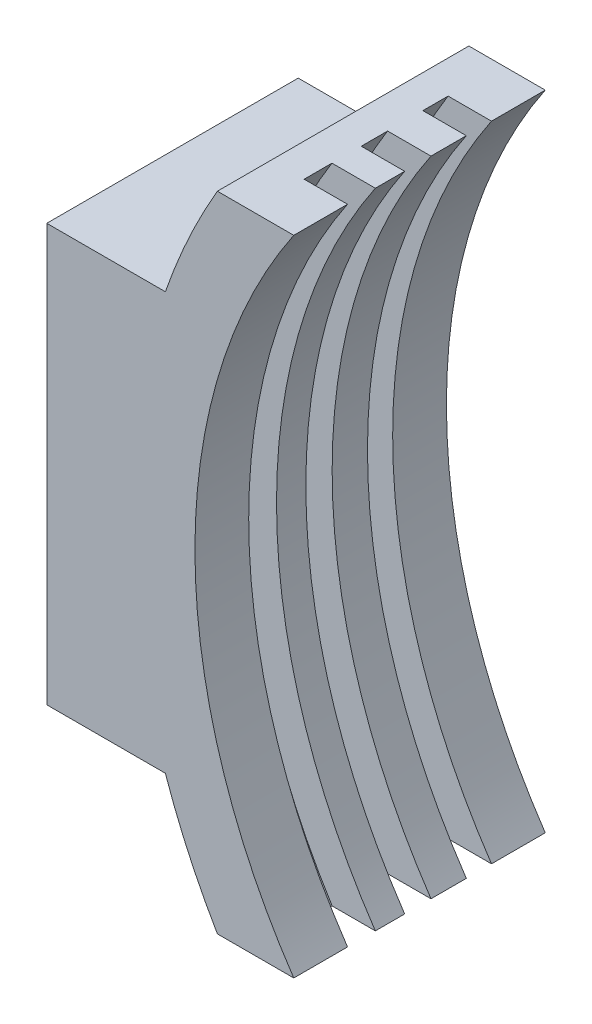
ISO-10303-21;
HEADER;
FILE_DESCRIPTION(('STEP AP214'),'2;1');
FILE_NAME('part.step','',(''),(''),'','','');
FILE_SCHEMA(('AUTOMOTIVE_DESIGN { 1 0 10303 214 1 1 1 1 }'));
ENDSEC;
DATA;
#1=APPLICATION_CONTEXT('core data for automotive mechanical design processes');
#2=APPLICATION_PROTOCOL_DEFINITION('international standard','automotive_design',2000,#1);
#3=PRODUCT_CONTEXT('',#1,'mechanical');
#4=PRODUCT('Part','Part','',(#3));
#5=PRODUCT_RELATED_PRODUCT_CATEGORY('part','',(#4));
#6=PRODUCT_DEFINITION_FORMATION('','',#4);
#7=PRODUCT_DEFINITION_CONTEXT('part definition',#1,'design');
#8=PRODUCT_DEFINITION('design','',#6,#7);
#9=PRODUCT_DEFINITION_SHAPE('','',#8);
#10=(LENGTH_UNIT() NAMED_UNIT(*) SI_UNIT(.MILLI.,.METRE.));
#11=(NAMED_UNIT(*) PLANE_ANGLE_UNIT() SI_UNIT($,.RADIAN.));
#12=(NAMED_UNIT(*) SI_UNIT($,.STERADIAN.) SOLID_ANGLE_UNIT());
#13=UNCERTAINTY_MEASURE_WITH_UNIT(LENGTH_MEASURE(1.E-05),#10,'distance_accuracy_value','');
#14=(GEOMETRIC_REPRESENTATION_CONTEXT(3) GLOBAL_UNCERTAINTY_ASSIGNED_CONTEXT((#13)) GLOBAL_UNIT_ASSIGNED_CONTEXT((#10,
#11,#12)) REPRESENTATION_CONTEXT('',''));
#15=CARTESIAN_POINT('',(0.,0.,0.));
#16=DIRECTION('',(0.,0.,1.));
#17=DIRECTION('',(1.,0.,0.));
#18=AXIS2_PLACEMENT_3D('',#15,#16,#17);
#19=CARTESIAN_POINT('',(2.33847709716404,-17.6822716441457,103.936667758293));
#20=DIRECTION('',(0.,1.,0.));
#21=DIRECTION('',(0.,0.,1.));
#22=AXIS2_PLACEMENT_3D('',#19,#20,#21);
#23=PLANE('',#22);
#24=CARTESIAN_POINT('',(2.59135219597086,-17.682271644147,136.685134373082));
#25=CARTESIAN_POINT('',(2.26631899742951,-17.6822716441462,136.685134373082));
#26=CARTESIAN_POINT('',(1.94128579888817,-17.6822716441459,136.685134373082));
#27=CARTESIAN_POINT('',(1.45373600107615,-17.6822716441457,136.685134373082));
#28=CARTESIAN_POINT('',(1.29121940180547,-17.6822716441457,136.685134373082));
#29=CARTESIAN_POINT('',(0.966186203263053,-17.6822716441458,136.685134373082));
#30=CARTESIAN_POINT('',(0.803669603991306,-17.6822716441459,136.685134373082));
#31=CARTESIAN_POINT('',(0.641153004719559,-17.682271644146,136.685134373082));
#32=B_SPLINE_CURVE_WITH_KNOTS('',3,(#24,#25,#26,#27,#28,#29,#30,#31),.UNSPECIFIED.,.F.,.F.,(4,2,
2,4),(0.,0.975099595624041,1.46264939343606,1.9501991912513),.UNSPECIFIED.);
#33=CARTESIAN_POINT('',(2.33847709716403,-17.6822716441457,136.685134373082));
#34=VERTEX_POINT('',#33);
#35=CARTESIAN_POINT('',(0.641153004722779,-17.6822716441512,136.685134373082));
#36=VERTEX_POINT('',#35);
#37=EDGE_CURVE('E184',#34,#36,#32,.T.);
#38=ORIENTED_EDGE('',*,*,#37,.T.);
#39=DIRECTION('',(1.17860060000748E-13,-1.20637906532752E-13,-1.));
#40=VECTOR('',#39,1.);
#41=CARTESIAN_POINT('',(0.641153004719128,-17.6822716441457,137.23155874318));
#42=LINE('',#41,#40);
#43=CARTESIAN_POINT('',(0.641153004718913,-17.6822716441458,137.777983113278));
#44=VERTEX_POINT('',#43);
#45=EDGE_CURVE('E183',#36,#44,#42,.F.);
#46=ORIENTED_EDGE('',*,*,#45,.T.);
#47=CARTESIAN_POINT('',(0.641153004722285,-17.6822716441485,137.777983113278));
#48=CARTESIAN_POINT('',(0.803669603992983,-17.6822716441469,137.777983113278));
#49=CARTESIAN_POINT('',(0.966186203263682,-17.6822716441461,137.777983113278));
#50=CARTESIAN_POINT('',(1.29121940180508,-17.6822716441454,137.777983113278));
#51=CARTESIAN_POINT('',(1.45373600107578,-17.6822716441455,137.777983113278));
#52=CARTESIAN_POINT('',(1.94128579888734,-17.6822716441462,137.777983113278));
#53=CARTESIAN_POINT('',(2.2663189974282,-17.6822716441471,137.777983113278));
#54=CARTESIAN_POINT('',(2.59135219596907,-17.6822716441459,137.777983113278));
#55=B_SPLINE_CURVE_WITH_KNOTS('',3,(#47,#48,#49,#50,#51,#52,#53,#54),.UNSPECIFIED.,.F.,.F.,(4,2,
2,4),(0.,0.487549797812095,0.97509959562419,1.95019919124678),.UNSPECIFIED.);
#56=CARTESIAN_POINT('',(2.33847709713561,-17.6822716441457,137.777983113278));
#57=VERTEX_POINT('',#56);
#58=EDGE_CURVE('E190',#44,#57,#55,.T.);
#59=ORIENTED_EDGE('',*,*,#58,.T.);
#60=DIRECTION('',(0.,0.,1.));
#61=VECTOR('',#60,1.);
#62=CARTESIAN_POINT('',(2.33847709716403,-17.6822716441457,103.936667758293));
#63=LINE('',#62,#61);
#64=CARTESIAN_POINT('',(2.33847709716403,-17.6822716441457,139.890052007236));
#65=VERTEX_POINT('',#64);
#66=EDGE_CURVE('E383',#57,#65,#63,.T.);
#67=ORIENTED_EDGE('',*,*,#66,.T.);
#68=DIRECTION('',(-1.,0.,0.));
#69=VECTOR('',#68,1.);
#70=CARTESIAN_POINT('',(2.33847709716404,-17.6822716441457,139.890052007236));
#71=LINE('',#70,#69);
#72=CARTESIAN_POINT('',(-0.662612790433288,-17.6822716441457,139.890052007236));
#73=VERTEX_POINT('',#72);
#74=EDGE_CURVE('E365',#65,#73,#71,.T.);
#75=ORIENTED_EDGE('',*,*,#74,.T.);
#76=DIRECTION('',(0.,0.,1.));
#77=VECTOR('',#76,1.);
#78=CARTESIAN_POINT('',(-0.662612790433288,-17.6822716441457,103.936667758293));
#79=LINE('',#78,#77);
#80=CARTESIAN_POINT('',(-0.662612790433288,-17.6822716441457,130.009975264211));
#81=VERTEX_POINT('',#80);
#82=EDGE_CURVE('E396',#81,#73,#79,.T.);
#83=ORIENTED_EDGE('',*,*,#82,.F.);
#84=DIRECTION('',(-1.,0.,0.));
#85=VECTOR('',#84,1.);
#86=CARTESIAN_POINT('',(2.33847709716404,-17.6822716441457,130.009975264211));
#87=LINE('',#86,#85);
#88=CARTESIAN_POINT('',(2.33847709716403,-17.6822716441457,130.009975264211));
#89=VERTEX_POINT('',#88);
#90=EDGE_CURVE('E393',#89,#81,#87,.T.);
#91=ORIENTED_EDGE('',*,*,#90,.F.);
#92=CARTESIAN_POINT('',(2.33847709716403,-17.6822716441457,132.121752471455));
#93=VERTEX_POINT('',#92);
#94=EDGE_CURVE('E375',#89,#93,#63,.T.);
#95=ORIENTED_EDGE('',*,*,#94,.T.);
#96=CARTESIAN_POINT('',(2.59132516654558,-17.682271644147,132.121752471455));
#97=CARTESIAN_POINT('',(2.26628647072023,-17.6822716441463,132.121752471455));
#98=CARTESIAN_POINT('',(1.94124777489487,-17.6822716441459,132.121752471454));
#99=CARTESIAN_POINT('',(1.45368973115684,-17.6822716441457,132.121752471453));
#100=CARTESIAN_POINT('',(1.29117038324416,-17.6822716441457,132.121752471453));
#101=CARTESIAN_POINT('',(0.966131687417705,-17.6822716441458,132.121752471452));
#102=CARTESIAN_POINT('',(0.803612339503932,-17.6822716441459,132.121752471452));
#103=CARTESIAN_POINT('',(0.641092991590159,-17.682271644146,132.121752471451));
#104=B_SPLINE_CURVE_WITH_KNOTS('',3,(#96,#97,#98,#99,#100,#101,#102,#103),.UNSPECIFIED.,.F.,.F.,
(4,2,2,4),(0.,0.975116087476069,1.4626741312141,1.95023217495542),.UNSPECIFIED.);
#105=CARTESIAN_POINT('',(0.641092991593444,-17.6822716441513,132.121752471451));
#106=VERTEX_POINT('',#105);
#107=EDGE_CURVE('E286',#93,#106,#104,.T.);
#108=ORIENTED_EDGE('',*,*,#107,.T.);
#109=DIRECTION('',(0.,0.,-1.));
#110=VECTOR('',#109,1.);
#111=CARTESIAN_POINT('',(0.641092991592245,-17.6822716441458,132.616488049784));
#112=LINE('',#111,#110);
#113=CARTESIAN_POINT('',(0.641092991593897,-17.6822716441448,133.111223628116));
#114=VERTEX_POINT('',#113);
#115=EDGE_CURVE('E303',#106,#114,#112,.F.);
#116=ORIENTED_EDGE('',*,*,#115,.T.);
#117=CARTESIAN_POINT('',(0.641092991597995,-17.6822716441485,133.111223628116));
#118=CARTESIAN_POINT('',(0.803612339510466,-17.6822716441469,133.111223628116));
#119=CARTESIAN_POINT('',(0.966131687422936,-17.6822716441461,133.111223628116));
#120=CARTESIAN_POINT('',(1.29117038324788,-17.6822716441454,133.111223628117));
#121=CARTESIAN_POINT('',(1.45368973116035,-17.6822716441455,133.111223628118));
#122=CARTESIAN_POINT('',(1.94124777489723,-17.6822716441462,133.111223628118));
#123=CARTESIAN_POINT('',(2.26628647072164,-17.6822716441472,133.111223628119));
#124=CARTESIAN_POINT('',(2.59132516654604,-17.6822716441459,133.111223628119));
#125=B_SPLINE_CURVE_WITH_KNOTS('',3,(#117,#118,#119,#120,#121,#122,#123,#124),.UNSPECIFIED.,.F.,
.F.,(4,2,2,4),(0.,0.487558043737411,0.975116087474822,1.95023217494805),.UNSPECIFIED.);
#126=CARTESIAN_POINT('',(2.33847709716403,-17.6822716441458,133.111223628119));
#127=VERTEX_POINT('',#126);
#128=EDGE_CURVE('E294',#114,#127,#125,.T.);
#129=ORIENTED_EDGE('',*,*,#128,.T.);
#130=CARTESIAN_POINT('',(2.33847709716403,-17.6822716441458,134.499436892681));
#131=VERTEX_POINT('',#130);
#132=EDGE_CURVE('E381',#127,#131,#63,.T.);
#133=ORIENTED_EDGE('',*,*,#132,.T.);
#134=CARTESIAN_POINT('',(2.59135034117733,-17.682271644147,134.499436892682));
#135=CARTESIAN_POINT('',(2.26631715955795,-17.6822716441462,134.499436892681));
#136=CARTESIAN_POINT('',(1.94128397793857,-17.6822716441459,134.49943689268));
#137=CARTESIAN_POINT('',(1.4537342055095,-17.6822716441457,134.499436892678));
#138=CARTESIAN_POINT('',(1.29121761469981,-17.6822716441457,134.499436892677));
#139=CARTESIAN_POINT('',(0.96618443307936,-17.6822716441458,134.499436892676));
#140=CARTESIAN_POINT('',(0.803667842268597,-17.6822716441459,134.499436892676));
#141=CARTESIAN_POINT('',(0.641151251457834,-17.682271644146,134.499436892675));
#142=B_SPLINE_CURVE_WITH_KNOTS('',3,(#134,#135,#136,#137,#138,#139,#140,#141),.UNSPECIFIED.,.F.,
.F.,(4,2,2,4),(0.,0.97509954485814,1.46264931728721,1.9501990897195),.UNSPECIFIED.);
#143=CARTESIAN_POINT('',(0.641151251461054,-17.6822716441512,134.499436892675));
#144=VERTEX_POINT('',#143);
#145=EDGE_CURVE('E218',#131,#144,#142,.T.);
#146=ORIENTED_EDGE('',*,*,#145,.T.);
#147=DIRECTION('',(0.,0.,-1.));
#148=VECTOR('',#147,1.);
#149=CARTESIAN_POINT('',(0.641151251458011,-17.6822716441457,135.016324810335));
#150=LINE('',#149,#148);
#151=CARTESIAN_POINT('',(0.641151251458294,-17.6822716441456,135.533212727996));
#152=VERTEX_POINT('',#151);
#153=EDGE_CURVE('E265',#144,#152,#150,.F.);
#154=ORIENTED_EDGE('',*,*,#153,.T.);
#155=CARTESIAN_POINT('',(0.641151251461778,-17.6822716441485,135.533212727996));
#156=CARTESIAN_POINT('',(0.803667842271399,-17.6822716441469,135.533212727996));
#157=CARTESIAN_POINT('',(0.966184433081021,-17.6822716441461,135.533212727997));
#158=CARTESIAN_POINT('',(1.29121761470026,-17.6822716441454,135.533212727998));
#159=CARTESIAN_POINT('',(1.45373420550989,-17.6822716441455,135.533212727999));
#160=CARTESIAN_POINT('',(1.94128397793822,-17.6822716441462,135.533212728));
#161=CARTESIAN_POINT('',(2.26631715955693,-17.6822716441471,135.533212728001));
#162=CARTESIAN_POINT('',(2.59135034117565,-17.6822716441459,135.533212728002));
#163=B_SPLINE_CURVE_WITH_KNOTS('',3,(#155,#156,#157,#158,#159,#160,#161,#162),.UNSPECIFIED.,.F.,
.F.,(4,2,2,4),(0.,0.487549772428865,0.97509954485773,1.95019908971387),.UNSPECIFIED.);
#164=CARTESIAN_POINT('',(2.33847709716403,-17.6822716441457,135.533212728002));
#165=VERTEX_POINT('',#164);
#166=EDGE_CURVE('E228',#152,#165,#163,.T.);
#167=ORIENTED_EDGE('',*,*,#166,.T.);
#168=EDGE_CURVE('E710',#165,#34,#63,.T.);
#169=ORIENTED_EDGE('',*,*,#168,.T.);
#170=EDGE_LOOP('',(#38,#46,#59,#67,#75,#83,#91,#95,#108,#116,#129,#133,#146,#154,#167,#169));
#171=FACE_BOUND('',#170,.T.);
#172=ADVANCED_FACE('F33',(#171),#23,.F.);
#173=CARTESIAN_POINT('',(20.9558900491008,-5.047322693831,103.936667758293));
#174=DIRECTION('',(0.,0.,1.));
#175=DIRECTION('',(1.,0.,0.));
#176=AXIS2_PLACEMENT_3D('',#173,#174,#175);
#177=CYLINDRICAL_SURFACE('',#176,22.5);
#178=CARTESIAN_POINT('',(20.9558900491008,-5.047322693831,136.685134373085));
#179=DIRECTION('',(0.,-1.42812496290086E-13,1.));
#180=DIRECTION('',(0.,-1.,-1.42812496290086E-13));
#181=AXIS2_PLACEMENT_3D('',#178,#179,#180);
#182=CIRCLE('',#181,22.5);
#183=CARTESIAN_POINT('',(2.33847709716404,7.58762625648374,136.685134373168));
#184=VERTEX_POINT('',#183);
#185=EDGE_CURVE('E177',#34,#184,#182,.F.);
#186=ORIENTED_EDGE('',*,*,#185,.F.);
#187=ORIENTED_EDGE('',*,*,#168,.F.);
#188=CARTESIAN_POINT('',(20.9558900491008,-5.047322693831,135.53321272801));
#189=DIRECTION('',(0.,0.,-1.));
#190=DIRECTION('',(-1.,0.,0.));
#191=AXIS2_PLACEMENT_3D('',#188,#189,#190);
#192=CIRCLE('',#191,22.5);
#193=CARTESIAN_POINT('',(2.33847709716404,7.58762625648374,135.53321272801));
#194=VERTEX_POINT('',#193);
#195=EDGE_CURVE('E264',#194,#165,#192,.F.);
#196=ORIENTED_EDGE('',*,*,#195,.F.);
#197=DIRECTION('',(0.,0.,1.));
#198=VECTOR('',#197,1.);
#199=CARTESIAN_POINT('',(2.33847709716404,7.58762625648375,103.936667758293));
#200=LINE('',#199,#198);
#201=EDGE_CURVE('E377',#194,#184,#200,.T.);
#202=ORIENTED_EDGE('',*,*,#201,.T.);
#203=EDGE_LOOP('',(#186,#187,#196,#202));
#204=FACE_BOUND('',#203,.T.);
#205=ADVANCED_FACE('F338',(#204),#177,.F.);
#206=CARTESIAN_POINT('',(20.9558900491008,-5.047322693831,137.77798311328));
#207=DIRECTION('',(0.,0.,-1.));
#208=DIRECTION('',(-1.,0.,0.));
#209=AXIS2_PLACEMENT_3D('',#206,#207,#208);
#210=CIRCLE('',#209,22.5);
#211=CARTESIAN_POINT('',(2.33847709716404,7.58762625648375,137.777983113364));
#212=VERTEX_POINT('',#211);
#213=EDGE_CURVE('E192',#212,#57,#210,.F.);
#214=ORIENTED_EDGE('',*,*,#213,.F.);
#215=CARTESIAN_POINT('',(2.33847709716404,7.58762625648375,139.890052007236));
#216=VERTEX_POINT('',#215);
#217=EDGE_CURVE('E374',#212,#216,#200,.T.);
#218=ORIENTED_EDGE('',*,*,#217,.T.);
#219=CARTESIAN_POINT('',(20.9558900491008,-5.047322693831,139.890052007236));
#220=DIRECTION('',(0.,0.,1.));
#221=DIRECTION('',(1.,0.,0.));
#222=AXIS2_PLACEMENT_3D('',#219,#220,#221);
#223=CIRCLE('',#222,22.5);
#224=EDGE_CURVE('E368',#216,#65,#223,.T.);
#225=ORIENTED_EDGE('',*,*,#224,.T.);
#226=ORIENTED_EDGE('',*,*,#66,.F.);
#227=EDGE_LOOP('',(#214,#218,#225,#226));
#228=FACE_BOUND('',#227,.T.);
#229=ADVANCED_FACE('F333',(#228),#177,.F.);
#230=CARTESIAN_POINT('',(2.33847709716404,7.58762625648375,103.936667758293));
#231=DIRECTION('',(0.,1.,0.));
#232=DIRECTION('',(0.,0.,1.));
#233=AXIS2_PLACEMENT_3D('',#230,#231,#232);
#234=PLANE('',#233);
#235=DIRECTION('',(1.17860060000748E-13,-1.20637906532752E-13,-1.));
#236=VECTOR('',#235,1.);
#237=CARTESIAN_POINT('',(0.633812600171964,7.58762625648375,137.231558743184));
#238=LINE('',#237,#236);
#239=CARTESIAN_POINT('',(0.633812600170804,7.58762625648447,136.685134373085));
#240=VERTEX_POINT('',#239);
#241=CARTESIAN_POINT('',(0.633812594275795,7.58762625648375,137.777983113277));
#242=VERTEX_POINT('',#241);
#243=EDGE_CURVE('E48',#240,#242,#238,.F.);
#244=ORIENTED_EDGE('',*,*,#243,.F.);
#245=DIRECTION('',(1.,0.,0.));
#246=VECTOR('',#245,1.);
#247=CARTESIAN_POINT('',(2.33847709716171,7.58762625648375,136.685134373086));
#248=LINE('',#247,#246);
#249=EDGE_CURVE('E11',#240,#184,#248,.T.);
#250=ORIENTED_EDGE('',*,*,#249,.T.);
#251=ORIENTED_EDGE('',*,*,#201,.F.);
#252=CARTESIAN_POINT('',(0.633816113357291,7.58762625175723,135.53321272801));
#253=CARTESIAN_POINT('',(0.796850086461559,7.58762625435698,135.53321272801));
#254=CARTESIAN_POINT('',(0.959884059565828,7.58762625577487,135.53321272801));
#255=CARTESIAN_POINT('',(1.3674689923265,7.58762625754707,135.53321272801));
#256=CARTESIAN_POINT('',(1.6120199519829,7.58762625701511,135.53321272801));
#257=CARTESIAN_POINT('',(2.1011218712951,7.58762625595239,135.53321272801));
#258=CARTESIAN_POINT('',(2.3456728309509,7.58762625542162,135.53321272801));
#259=CARTESIAN_POINT('',(2.5902237906067,7.58762625648733,135.53321272801));
#260=B_SPLINE_CURVE_WITH_KNOTS('',3,(#252,#253,#254,#255,#256,#257,#258,#259),.UNSPECIFIED.,.F.,
.F.,(4,2,2,4),(0.,0.489101919312805,1.22275479828201,1.95640767724941),.UNSPECIFIED.);
#261=CARTESIAN_POINT('',(0.633816113357291,7.58762625648375,135.53321272801));
#262=VERTEX_POINT('',#261);
#263=EDGE_CURVE('E258',#262,#194,#260,.T.);
#264=ORIENTED_EDGE('',*,*,#263,.F.);
#265=DIRECTION('',(0.,0.,-1.));
#266=VECTOR('',#265,1.);
#267=CARTESIAN_POINT('',(0.633816119264953,7.58762625648374,135.01632481035));
#268=LINE('',#267,#266);
#269=CARTESIAN_POINT('',(0.633816119264958,7.58762625648374,134.499436892689));
#270=VERTEX_POINT('',#269);
#271=EDGE_CURVE('E56',#270,#262,#268,.F.);
#272=ORIENTED_EDGE('',*,*,#271,.F.);
#273=DIRECTION('',(1.,0.,0.));
#274=VECTOR('',#273,1.);
#275=CARTESIAN_POINT('',(2.33847709716356,7.58762625648375,134.499436892689));
#276=LINE('',#275,#274);
#277=CARTESIAN_POINT('',(2.33847709716404,7.58762625648375,134.499436892689));
#278=VERTEX_POINT('',#277);
#279=EDGE_CURVE('E41',#270,#278,#276,.T.);
#280=ORIENTED_EDGE('',*,*,#279,.T.);
#281=CARTESIAN_POINT('',(2.33847709716404,7.58762625648375,133.111223628116));
#282=VERTEX_POINT('',#281);
#283=EDGE_CURVE('E406',#282,#278,#200,.T.);
#284=ORIENTED_EDGE('',*,*,#283,.F.);
#285=CARTESIAN_POINT('',(0.632484691729728,7.58762625923168,133.111223628114));
#286=CARTESIAN_POINT('',(0.795592141625512,7.5876262577205,133.111223628114));
#287=CARTESIAN_POINT('',(0.958699591521296,7.58762625689605,133.111223628114));
#288=CARTESIAN_POINT('',(1.36646821626076,7.58762625586529,133.111223628115));
#289=CARTESIAN_POINT('',(1.61112939110443,7.58762625617419,133.111223628115));
#290=CARTESIAN_POINT('',(2.10045174079112,7.58762625679331,133.111223628115));
#291=CARTESIAN_POINT('',(2.34511291563412,7.58762625710353,133.111223628116));
#292=CARTESIAN_POINT('',(2.58977409047712,7.58762625648774,133.111223628116));
#293=B_SPLINE_CURVE_WITH_KNOTS('',3,(#285,#286,#287,#288,#289,#290,#291,#292),.UNSPECIFIED.,.F.,
.F.,(4,2,2,4),(0.,0.489322349687353,1.22330587421838,1.9572893987474),.UNSPECIFIED.);
#294=CARTESIAN_POINT('',(0.632484691729728,7.58762625648375,133.111223628116));
#295=VERTEX_POINT('',#294);
#296=EDGE_CURVE('E307',#295,#282,#293,.T.);
#297=ORIENTED_EDGE('',*,*,#296,.F.);
#298=DIRECTION('',(0.,0.,-1.));
#299=VECTOR('',#298,1.);
#300=CARTESIAN_POINT('',(0.632484688305035,7.58762625648374,132.616488049782));
#301=LINE('',#300,#299);
#302=CARTESIAN_POINT('',(0.63248468830562,7.58762625648338,132.12175247145));
#303=VERTEX_POINT('',#302);
#304=EDGE_CURVE('E301',#303,#295,#301,.F.);
#305=ORIENTED_EDGE('',*,*,#304,.F.);
#306=DIRECTION('',(1.,0.,0.));
#307=VECTOR('',#306,1.);
#308=CARTESIAN_POINT('',(2.33847709716422,7.58762625648375,132.12175247145));
#309=LINE('',#308,#307);
#310=CARTESIAN_POINT('',(2.33847709716404,7.58762625648374,132.121752471451));
#311=VERTEX_POINT('',#310);
#312=EDGE_CURVE('E430',#303,#311,#309,.T.);
#313=ORIENTED_EDGE('',*,*,#312,.T.);
#314=CARTESIAN_POINT('',(2.33847709716404,7.58762625648375,130.009975264211));
#315=VERTEX_POINT('',#314);
#316=EDGE_CURVE('E379',#315,#311,#200,.T.);
#317=ORIENTED_EDGE('',*,*,#316,.F.);
#318=DIRECTION('',(-1.,0.,0.));
#319=VECTOR('',#318,1.);
#320=CARTESIAN_POINT('',(2.33847709716404,7.58762625648375,130.009975264211));
#321=LINE('',#320,#319);
#322=CARTESIAN_POINT('',(-0.662612790433281,7.58762625648374,130.009975264211));
#323=VERTEX_POINT('',#322);
#324=EDGE_CURVE('E397',#315,#323,#321,.T.);
#325=ORIENTED_EDGE('',*,*,#324,.T.);
#326=DIRECTION('',(0.,0.,1.));
#327=VECTOR('',#326,1.);
#328=CARTESIAN_POINT('',(-0.662612790433281,7.58762625648374,103.936667758293));
#329=LINE('',#328,#327);
#330=CARTESIAN_POINT('',(-0.662612790433281,7.58762625648374,139.890052007236));
#331=VERTEX_POINT('',#330);
#332=EDGE_CURVE('E400',#323,#331,#329,.T.);
#333=ORIENTED_EDGE('',*,*,#332,.T.);
#334=DIRECTION('',(-1.,0.,0.));
#335=VECTOR('',#334,1.);
#336=CARTESIAN_POINT('',(2.33847709716404,7.58762625648375,139.890052007236));
#337=LINE('',#336,#335);
#338=EDGE_CURVE('E391',#216,#331,#337,.T.);
#339=ORIENTED_EDGE('',*,*,#338,.F.);
#340=ORIENTED_EDGE('',*,*,#217,.F.);
#341=CARTESIAN_POINT('',(0.633812594275795,7.58762625176511,137.777983113282));
#342=CARTESIAN_POINT('',(0.796847029947132,7.58762625436053,137.777983113281));
#343=CARTESIAN_POINT('',(0.959881465618469,7.58762625577605,137.777983113285));
#344=CARTESIAN_POINT('',(1.36746755479681,7.58762625754529,137.777983113302));
#345=CARTESIAN_POINT('',(1.61201920830382,7.58762625701422,137.777983113318));
#346=CARTESIAN_POINT('',(2.10112251531723,7.58762625595327,137.777983113351));
#347=CARTESIAN_POINT('',(2.34567416882363,7.5876262554234,137.777983113366));
#348=CARTESIAN_POINT('',(2.59022582233003,7.58762625648733,137.777983113374));
#349=B_SPLINE_CURVE_WITH_KNOTS('',3,(#341,#342,#343,#344,#345,#346,#347,#348),.UNSPECIFIED.,.F.,
.F.,(4,2,2,4),(0.,0.489103307014012,1.22275826753503,1.95641322805424),.UNSPECIFIED.);
#350=EDGE_CURVE('E189',#242,#212,#349,.T.);
#351=ORIENTED_EDGE('',*,*,#350,.F.);
#352=EDGE_LOOP('',(#244,#250,#251,#264,#272,#280,#284,#297,#305,#313,#317,#325,#333,#339,#340,#351));
#353=FACE_BOUND('',#352,.T.);
#354=ADVANCED_FACE('F187',(#353),#234,.T.);
#355=CARTESIAN_POINT('',(20.9558900491008,-5.047322693831,134.49943689269));
#356=DIRECTION('',(0.,0.,1.));
#357=DIRECTION('',(1.,0.,0.));
#358=AXIS2_PLACEMENT_3D('',#355,#356,#357);
#359=CIRCLE('',#358,22.5);
#360=EDGE_CURVE('E449',#131,#278,#359,.F.);
#361=ORIENTED_EDGE('',*,*,#360,.F.);
#362=ORIENTED_EDGE('',*,*,#132,.F.);
#363=CARTESIAN_POINT('',(20.9558900491008,-5.047322693831,133.111223628115));
#364=DIRECTION('',(0.,0.,-1.));
#365=DIRECTION('',(-1.,0.,0.));
#366=AXIS2_PLACEMENT_3D('',#363,#364,#365);
#367=CIRCLE('',#366,22.5);
#368=EDGE_CURVE('E314',#282,#127,#367,.F.);
#369=ORIENTED_EDGE('',*,*,#368,.F.);
#370=ORIENTED_EDGE('',*,*,#283,.T.);
#371=EDGE_LOOP('',(#361,#362,#369,#370));
#372=FACE_BOUND('',#371,.T.);
#373=ADVANCED_FACE('F332',(#372),#177,.F.);
#374=CARTESIAN_POINT('',(20.9558900491008,-5.047322693831,132.12175247145));
#375=DIRECTION('',(0.,0.,1.));
#376=DIRECTION('',(0.,-1.,0.));
#377=AXIS2_PLACEMENT_3D('',#374,#375,#376);
#378=CIRCLE('',#377,22.5);
#379=EDGE_CURVE('E403',#93,#311,#378,.F.);
#380=ORIENTED_EDGE('',*,*,#379,.F.);
#381=ORIENTED_EDGE('',*,*,#94,.F.);
#382=CARTESIAN_POINT('',(20.9558900491008,-5.047322693831,130.009975264211));
#383=DIRECTION('',(0.,0.,-1.));
#384=DIRECTION('',(-1.,0.,0.));
#385=AXIS2_PLACEMENT_3D('',#382,#383,#384);
#386=CIRCLE('',#385,22.5);
#387=EDGE_CURVE('E401',#315,#89,#386,.F.);
#388=ORIENTED_EDGE('',*,*,#387,.F.);
#389=ORIENTED_EDGE('',*,*,#316,.T.);
#390=EDGE_LOOP('',(#380,#381,#388,#389));
#391=FACE_BOUND('',#390,.T.);
#392=ADVANCED_FACE('F334',(#391),#177,.F.);
#393=CARTESIAN_POINT('',(-7.366,3.144177306169,130.009975264211));
#394=DIRECTION('',(0.,1.,0.));
#395=DIRECTION('',(0.,0.,1.));
#396=AXIS2_PLACEMENT_3D('',#393,#394,#395);
#397=PLANE('',#396);
#398=DIRECTION('',(0.,0.,1.));
#399=VECTOR('',#398,1.);
#400=CARTESIAN_POINT('',(-2.70633570736605,3.144177306169,103.936667758293));
#401=LINE('',#400,#399);
#402=CARTESIAN_POINT('',(-2.70633570736605,3.144177306169,130.009975264211));
#403=VERTEX_POINT('',#402);
#404=CARTESIAN_POINT('',(-2.70633570736605,3.144177306169,139.890052007236));
#405=VERTEX_POINT('',#404);
#406=EDGE_CURVE('E412',#403,#405,#401,.T.);
#407=ORIENTED_EDGE('',*,*,#406,.F.);
#408=DIRECTION('',(1.,0.,0.));
#409=VECTOR('',#408,1.);
#410=CARTESIAN_POINT('',(-7.366,3.144177306169,130.009975264211));
#411=LINE('',#410,#409);
#412=CARTESIAN_POINT('',(-7.366,3.144177306169,130.009975264211));
#413=VERTEX_POINT('',#412);
#414=EDGE_CURVE('E427',#413,#403,#411,.T.);
#415=ORIENTED_EDGE('',*,*,#414,.F.);
#416=DIRECTION('',(0.,0.,1.));
#417=VECTOR('',#416,1.);
#418=CARTESIAN_POINT('',(-7.366,3.144177306169,130.009975264211));
#419=LINE('',#418,#417);
#420=CARTESIAN_POINT('',(-7.366,3.144177306169,139.890052007236));
#421=VERTEX_POINT('',#420);
#422=EDGE_CURVE('E414',#413,#421,#419,.T.);
#423=ORIENTED_EDGE('',*,*,#422,.T.);
#424=DIRECTION('',(1.,0.,0.));
#425=VECTOR('',#424,1.);
#426=CARTESIAN_POINT('',(-7.366,3.144177306169,139.890052007236));
#427=LINE('',#426,#425);
#428=EDGE_CURVE('E426',#421,#405,#427,.T.);
#429=ORIENTED_EDGE('',*,*,#428,.T.);
#430=EDGE_LOOP('',(#407,#415,#423,#429));
#431=FACE_BOUND('',#430,.T.);
#432=ADVANCED_FACE('F35',(#431),#397,.T.);
#433=CARTESIAN_POINT('',(-7.366,-13.238822693831,130.009975264211));
#434=DIRECTION('',(0.,0.,-1.));
#435=DIRECTION('',(-1.,0.,0.));
#436=AXIS2_PLACEMENT_3D('',#433,#434,#435);
#437=PLANE('',#436);
#438=ORIENTED_EDGE('',*,*,#387,.T.);
#439=ORIENTED_EDGE('',*,*,#90,.T.);
#440=CARTESIAN_POINT('',(20.9558900491008,-5.047322693831,130.009975264211));
#441=DIRECTION('',(0.,0.,-1.));
#442=DIRECTION('',(-1.,0.,0.));
#443=AXIS2_PLACEMENT_3D('',#440,#441,#442);
#444=CIRCLE('',#443,25.04);
#445=CARTESIAN_POINT('',(-2.70633570736605,-13.238822693831,130.009975264211));
#446=VERTEX_POINT('',#445);
#447=EDGE_CURVE('E390',#446,#81,#444,.F.);
#448=ORIENTED_EDGE('',*,*,#447,.F.);
#449=DIRECTION('',(1.,0.,0.));
#450=VECTOR('',#449,1.);
#451=CARTESIAN_POINT('',(-7.366,-13.238822693831,130.009975264211));
#452=LINE('',#451,#450);
#453=CARTESIAN_POINT('',(-7.366,-13.238822693831,130.009975264211));
#454=VERTEX_POINT('',#453);
#455=EDGE_CURVE('E431',#454,#446,#452,.T.);
#456=ORIENTED_EDGE('',*,*,#455,.F.);
#457=DIRECTION('',(0.,1.,0.));
#458=VECTOR('',#457,1.);
#459=CARTESIAN_POINT('',(-7.366,-13.238822693831,130.009975264211));
#460=LINE('',#459,#458);
#461=EDGE_CURVE('E423',#454,#413,#460,.T.);
#462=ORIENTED_EDGE('',*,*,#461,.T.);
#463=ORIENTED_EDGE('',*,*,#414,.T.);
#464=EDGE_CURVE('E394',#323,#403,#444,.F.);
#465=ORIENTED_EDGE('',*,*,#464,.F.);
#466=ORIENTED_EDGE('',*,*,#324,.F.);
#467=EDGE_LOOP('',(#438,#439,#448,#456,#462,#463,#465,#466));
#468=FACE_BOUND('',#467,.T.);
#469=ADVANCED_FACE('F351',(#468),#437,.T.);
#470=CARTESIAN_POINT('',(-7.366,-13.238822693831,139.890052007236));
#471=DIRECTION('',(0.,-1.,0.));
#472=DIRECTION('',(0.,0.,-1.));
#473=AXIS2_PLACEMENT_3D('',#470,#471,#472);
#474=PLANE('',#473);
#475=DIRECTION('',(0.,0.,1.));
#476=VECTOR('',#475,1.);
#477=CARTESIAN_POINT('',(-2.70633570736605,-13.238822693831,103.936667758293));
#478=LINE('',#477,#476);
#479=CARTESIAN_POINT('',(-2.70633570736605,-13.238822693831,139.890052007236));
#480=VERTEX_POINT('',#479);
#481=EDGE_CURVE('E410',#480,#446,#478,.F.);
#482=ORIENTED_EDGE('',*,*,#481,.F.);
#483=DIRECTION('',(1.,0.,0.));
#484=VECTOR('',#483,1.);
#485=CARTESIAN_POINT('',(-7.366,-13.238822693831,139.890052007236));
#486=LINE('',#485,#484);
#487=CARTESIAN_POINT('',(-7.366,-13.238822693831,139.890052007236));
#488=VERTEX_POINT('',#487);
#489=EDGE_CURVE('E434',#488,#480,#486,.T.);
#490=ORIENTED_EDGE('',*,*,#489,.F.);
#491=DIRECTION('',(0.,0.,-1.));
#492=VECTOR('',#491,1.);
#493=CARTESIAN_POINT('',(-7.366,-13.238822693831,139.890052007236));
#494=LINE('',#493,#492);
#495=EDGE_CURVE('E420',#488,#454,#494,.T.);
#496=ORIENTED_EDGE('',*,*,#495,.T.);
#497=ORIENTED_EDGE('',*,*,#455,.T.);
#498=EDGE_LOOP('',(#482,#490,#496,#497));
#499=FACE_BOUND('',#498,.T.);
#500=ADVANCED_FACE('F354',(#499),#474,.T.);
#501=CARTESIAN_POINT('',(-7.366,3.144177306169,139.890052007236));
#502=DIRECTION('',(0.,0.,1.));
#503=DIRECTION('',(1.,0.,0.));
#504=AXIS2_PLACEMENT_3D('',#501,#502,#503);
#505=PLANE('',#504);
#506=ORIENTED_EDGE('',*,*,#74,.F.);
#507=ORIENTED_EDGE('',*,*,#224,.F.);
#508=ORIENTED_EDGE('',*,*,#338,.T.);
#509=CARTESIAN_POINT('',(20.9558900491008,-5.047322693831,139.890052007236));
#510=DIRECTION('',(0.,0.,1.));
#511=DIRECTION('',(1.,0.,0.));
#512=AXIS2_PLACEMENT_3D('',#509,#510,#511);
#513=CIRCLE('',#512,25.04);
#514=EDGE_CURVE('E387',#331,#405,#513,.T.);
#515=ORIENTED_EDGE('',*,*,#514,.T.);
#516=ORIENTED_EDGE('',*,*,#428,.F.);
#517=DIRECTION('',(0.,-1.,0.));
#518=VECTOR('',#517,1.);
#519=CARTESIAN_POINT('',(-7.366,3.144177306169,139.890052007236));
#520=LINE('',#519,#518);
#521=EDGE_CURVE('E417',#421,#488,#520,.T.);
#522=ORIENTED_EDGE('',*,*,#521,.T.);
#523=ORIENTED_EDGE('',*,*,#489,.T.);
#524=EDGE_CURVE('E371',#480,#73,#513,.T.);
#525=ORIENTED_EDGE('',*,*,#524,.T.);
#526=EDGE_LOOP('',(#506,#507,#508,#515,#516,#522,#523,#525));
#527=FACE_BOUND('',#526,.T.);
#528=ADVANCED_FACE('F349',(#527),#505,.T.);
#529=CARTESIAN_POINT('',(-7.366,0.,0.));
#530=DIRECTION('',(1.,0.,0.));
#531=DIRECTION('',(0.,0.,-1.));
#532=AXIS2_PLACEMENT_3D('',#529,#530,#531);
#533=PLANE('',#532);
#534=ORIENTED_EDGE('',*,*,#422,.F.);
#535=ORIENTED_EDGE('',*,*,#461,.F.);
#536=ORIENTED_EDGE('',*,*,#495,.F.);
#537=ORIENTED_EDGE('',*,*,#521,.F.);
#538=EDGE_LOOP('',(#534,#535,#536,#537));
#539=FACE_BOUND('',#538,.T.);
#540=ADVANCED_FACE('F345',(#539),#533,.F.);
#541=CARTESIAN_POINT('',(20.9558900491008,-5.047322693831,103.936667758293));
#542=DIRECTION('',(0.,0.,1.));
#543=DIRECTION('',(1.,0.,0.));
#544=AXIS2_PLACEMENT_3D('',#541,#542,#543);
#545=CYLINDRICAL_SURFACE('',#544,25.04);
#546=ORIENTED_EDGE('',*,*,#524,.F.);
#547=ORIENTED_EDGE('',*,*,#481,.T.);
#548=ORIENTED_EDGE('',*,*,#447,.T.);
#549=ORIENTED_EDGE('',*,*,#82,.T.);
#550=EDGE_LOOP('',(#546,#547,#548,#549));
#551=FACE_BOUND('',#550,.T.);
#552=ADVANCED_FACE('F342',(#551),#545,.T.);
#553=ORIENTED_EDGE('',*,*,#464,.T.);
#554=ORIENTED_EDGE('',*,*,#406,.T.);
#555=ORIENTED_EDGE('',*,*,#514,.F.);
#556=ORIENTED_EDGE('',*,*,#332,.F.);
#557=EDGE_LOOP('',(#553,#554,#555,#556));
#558=FACE_BOUND('',#557,.T.);
#559=ADVANCED_FACE('F325',(#558),#545,.T.);
#560=CARTESIAN_POINT('',(1.48238831705991,-18.9458815864917,132.121752471451));
#561=DIRECTION('',(0.,0.,1.));
#562=DIRECTION('',(0.990272689440125,0.139140219020316,0.));
#563=AXIS2_PLACEMENT_3D('',#560,#561,#562);
#564=PLANE('',#563);
#565=ORIENTED_EDGE('',*,*,#379,.T.);
#566=ORIENTED_EDGE('',*,*,#312,.F.);
#567=CARTESIAN_POINT('',(1.48238831705991,-18.9458815864917,132.121752471451));
#568=CARTESIAN_POINT('',(0.78334098015067,-17.9536152793392,132.121752471451));
#569=CARTESIAN_POINT('',(0.112554464115539,-16.87357051721,132.121752471451));
#570=CARTESIAN_POINT('',(-1.46990138921801,-13.6949634051171,132.121752471451));
#571=CARTESIAN_POINT('',(-2.2343586059714,-11.4297561716586,132.121752471451));
#572=CARTESIAN_POINT('',(-3.03927247071613,-6.66761296826496,132.121752471451));
#573=CARTESIAN_POINT('',(-3.08308815247379,-4.2045761005367,132.121752471451));
#574=CARTESIAN_POINT('',(-2.42174833175594,0.603857650651156,132.121752471451));
#575=CARTESIAN_POINT('',(-1.72730846681742,2.93115022509704,132.12175247145));
#576=CARTESIAN_POINT('',(-0.238070096507128,6.12415802453654,132.12175247145));
#577=CARTESIAN_POINT('',(0.322855894699223,7.13361175206769,132.12175247145));
#578=CARTESIAN_POINT('',(1.58723305631876,9.04666094889743,132.12175247145));
#579=CARTESIAN_POINT('',(2.2723245039371,9.92469054665643,132.12175247145));
#580=CARTESIAN_POINT('',(2.90179014186373,10.7444001324407,132.12175247145));
#581=B_SPLINE_CURVE_WITH_KNOTS('',3,(#567,#568,#569,#570,#571,#572,#573,#574,#575,#576,#577,
#578,#579,#580),.UNSPECIFIED.,.F.,.F.,(4,2,2,2,2,2,4),(0.,0.1160897507213,0.337067313040975,
0.55804487536065,0.779022437680325,0.889511218840162,1.),.UNSPECIFIED.);
#582=EDGE_CURVE('E306',#106,#303,#581,.T.);
#583=ORIENTED_EDGE('',*,*,#582,.F.);
#584=ORIENTED_EDGE('',*,*,#107,.F.);
#585=EDGE_LOOP('',(#565,#566,#583,#584));
#586=FACE_BOUND('',#585,.T.);
#587=ADVANCED_FACE('F321',(#586),#564,.T.);
#588=CARTESIAN_POINT('',(3.31045970406236,-18.6890248076623,133.111223628116));
#589=DIRECTION('',(0.,0.,-1.));
#590=DIRECTION('',(-0.990272689440125,-0.139140219020316,0.));
#591=AXIS2_PLACEMENT_3D('',#588,#589,#590);
#592=PLANE('',#591);
#593=ORIENTED_EDGE('',*,*,#368,.T.);
#594=ORIENTED_EDGE('',*,*,#128,.F.);
#595=CARTESIAN_POINT('',(1.48238831705992,-18.9458815864917,133.111223628116));
#596=CARTESIAN_POINT('',(0.783340980163212,-17.9536152793429,133.111223628116));
#597=CARTESIAN_POINT('',(0.112554464108632,-16.8735705171981,133.111223628116));
#598=CARTESIAN_POINT('',(-1.46990138920487,-13.6949634051397,133.111223628116));
#599=CARTESIAN_POINT('',(-2.23435860597154,-11.4297561716586,133.111223628115));
#600=CARTESIAN_POINT('',(-3.03927247071627,-6.66761296826496,133.111223628115));
#601=CARTESIAN_POINT('',(-3.08308815247421,-4.20457610053664,133.111223628115));
#602=CARTESIAN_POINT('',(-2.42174833175636,0.603857650651224,133.111223628115));
#603=CARTESIAN_POINT('',(-1.72730846681816,2.93115022509739,133.111223628114));
#604=CARTESIAN_POINT('',(-0.238070096507875,6.12415802453689,133.111223628114));
#605=CARTESIAN_POINT('',(0.322855894698341,7.13361175207012,133.111223628114));
#606=CARTESIAN_POINT('',(1.58723305631788,9.04666094889614,133.111223628114));
#607=CARTESIAN_POINT('',(2.27232450393812,9.92469054665708,133.111223628114));
#608=CARTESIAN_POINT('',(2.90179014186276,10.7444001324414,133.111223628114));
#609=B_SPLINE_CURVE_WITH_KNOTS('',3,(#595,#596,#597,#598,#599,#600,#601,#602,#603,#604,#605,
#606,#607,#608),.UNSPECIFIED.,.F.,.F.,(4,2,2,2,2,2,4),(0.,0.1160897507213,0.337067313040975,
0.55804487536065,0.779022437680325,0.889511218840162,1.),.UNSPECIFIED.);
#610=EDGE_CURVE('E302',#114,#295,#609,.T.);
#611=ORIENTED_EDGE('',*,*,#610,.T.);
#612=ORIENTED_EDGE('',*,*,#296,.T.);
#613=EDGE_LOOP('',(#593,#594,#611,#612));
#614=FACE_BOUND('',#613,.T.);
#615=ADVANCED_FACE('F324',(#614),#592,.T.);
#616=CARTESIAN_POINT('',(1.48238831705992,-18.9458815864917,133.111223628116));
#617=CARTESIAN_POINT('',(0.783340980163212,-17.9536152793429,133.111223628116));
#618=CARTESIAN_POINT('',(0.112554464108632,-16.8735705171981,133.111223628116));
#619=CARTESIAN_POINT('',(-1.46990138920487,-13.6949634051397,133.111223628116));
#620=CARTESIAN_POINT('',(-2.23435860597154,-11.4297561716586,133.111223628115));
#621=CARTESIAN_POINT('',(-3.03927247071627,-6.66761296826496,133.111223628115));
#622=CARTESIAN_POINT('',(-3.08308815247421,-4.20457610053664,133.111223628115));
#623=CARTESIAN_POINT('',(-2.42174833175636,0.603857650651224,133.111223628115));
#624=CARTESIAN_POINT('',(-1.72730846681816,2.93115022509739,133.111223628114));
#625=CARTESIAN_POINT('',(-0.238070096507875,6.12415802453689,133.111223628114));
#626=CARTESIAN_POINT('',(0.322855894698341,7.13361175207012,133.111223628114));
#627=CARTESIAN_POINT('',(1.58723305631788,9.04666094889614,133.111223628114));
#628=CARTESIAN_POINT('',(2.27232450393812,9.92469054665708,133.111223628114));
#629=CARTESIAN_POINT('',(2.90179014186276,10.7444001324414,133.111223628114));
#630=CARTESIAN_POINT('',(1.48238831705991,-18.9458815864917,132.121752471451));
#631=CARTESIAN_POINT('',(0.78334098015067,-17.9536152793392,132.121752471451));
#632=CARTESIAN_POINT('',(0.112554464115539,-16.87357051721,132.121752471451));
#633=CARTESIAN_POINT('',(-1.46990138921801,-13.6949634051171,132.121752471451));
#634=CARTESIAN_POINT('',(-2.2343586059714,-11.4297561716586,132.121752471451));
#635=CARTESIAN_POINT('',(-3.03927247071613,-6.66761296826496,132.121752471451));
#636=CARTESIAN_POINT('',(-3.08308815247379,-4.2045761005367,132.121752471451));
#637=CARTESIAN_POINT('',(-2.42174833175594,0.603857650651156,132.121752471451));
#638=CARTESIAN_POINT('',(-1.72730846681742,2.93115022509704,132.12175247145));
#639=CARTESIAN_POINT('',(-0.238070096507128,6.12415802453654,132.12175247145));
#640=CARTESIAN_POINT('',(0.322855894699223,7.13361175206769,132.12175247145));
#641=CARTESIAN_POINT('',(1.58723305631876,9.04666094889743,132.12175247145));
#642=CARTESIAN_POINT('',(2.2723245039371,9.92469054665643,132.12175247145));
#643=CARTESIAN_POINT('',(2.90179014186373,10.7444001324407,132.12175247145));
#644=B_SPLINE_SURFACE_WITH_KNOTS('',1,3,((#616,#617,#618,#619,#620,#621,#622,#623,#624,#625,
#626,#627,#628,#629),(#630,#631,#632,#633,#634,#635,#636,#637,#638,#639,#640,#641,#642,#643)),
.UNSPECIFIED.,.F.,.F.,.F.,(2,2),(4,2,2,2,2,2,4),(0.,1.),(0.,0.1160897507213,0.337067313040975,
0.55804487536065,0.779022437680325,0.889511218840162,1.),.UNSPECIFIED.);
#645=ORIENTED_EDGE('',*,*,#304,.T.);
#646=ORIENTED_EDGE('',*,*,#610,.F.);
#647=ORIENTED_EDGE('',*,*,#115,.F.);
#648=ORIENTED_EDGE('',*,*,#582,.T.);
#649=EDGE_LOOP('',(#645,#646,#647,#648));
#650=FACE_BOUND('',#649,.T.);
#651=ADVANCED_FACE('F273',(#650),#644,.T.);
#652=CARTESIAN_POINT('',(1.48250273248985,-18.9460409945518,134.499436892689));
#653=DIRECTION('',(0.,0.,1.));
#654=DIRECTION('',(0.990272183879832,0.139143817088176,0.));
#655=AXIS2_PLACEMENT_3D('',#652,#653,#654);
#656=PLANE('',#655);
#657=ORIENTED_EDGE('',*,*,#360,.T.);
#658=ORIENTED_EDGE('',*,*,#279,.F.);
#659=CARTESIAN_POINT('',(1.48250273248985,-18.9460409945518,134.499436892689));
#660=CARTESIAN_POINT('',(0.783431160592753,-17.9536537589016,134.499436892689));
#661=CARTESIAN_POINT('',(0.11211499786076,-16.8727247609068,134.499436892642));
#662=CARTESIAN_POINT('',(-1.4458790900948,-13.7431470885557,134.499436892778));
#663=CARTESIAN_POINT('',(-2.19832994120694,-11.5368827053589,134.499436892689));
#664=CARTESIAN_POINT('',(-3.01671482446364,-6.89856560817486,134.499436892689));
#665=CARTESIAN_POINT('',(-3.08569507805563,-4.49852807823952,134.499436892689));
#666=CARTESIAN_POINT('',(-2.50903015218966,0.203759126895991,134.499436892689));
#667=CARTESIAN_POINT('',(-1.87289861321362,2.48933939296114,134.499436892749));
#668=CARTESIAN_POINT('',(-0.481627517639047,5.64677537070162,134.499436892659));
#669=CARTESIAN_POINT('',(0.0464543551446253,6.64941874613815,134.499436892689));
#670=CARTESIAN_POINT('',(1.23985473757993,8.55569319273287,134.499436892689));
#671=CARTESIAN_POINT('',(1.89747850999442,9.4442165417128,134.499436892689));
#672=CARTESIAN_POINT('',(2.53439588760364,10.2646838208615,134.499436892689));
#673=B_SPLINE_CURVE_WITH_KNOTS('',3,(#659,#660,#661,#662,#663,#664,#665,#666,#667,#668,#669,
#670,#671,#672),.UNSPECIFIED.,.F.,.F.,(4,2,2,2,2,2,4),(0.,0.118431190647605,0.338823392985704,
0.559215595323802,0.779607797661901,0.889803898830951,1.),.UNSPECIFIED.);
#674=EDGE_CURVE('E227',#144,#270,#673,.T.);
#675=ORIENTED_EDGE('',*,*,#674,.F.);
#676=ORIENTED_EDGE('',*,*,#145,.F.);
#677=EDGE_LOOP('',(#657,#658,#675,#676));
#678=FACE_BOUND('',#677,.T.);
#679=ADVANCED_FACE('F269',(#678),#656,.T.);
#680=CARTESIAN_POINT('',(3.31057318621367,-18.6891775735874,135.53321272801));
#681=DIRECTION('',(0.,0.,-1.));
#682=DIRECTION('',(-0.990272183879832,-0.139143817088176,0.));
#683=AXIS2_PLACEMENT_3D('',#680,#681,#682);
#684=PLANE('',#683);
#685=ORIENTED_EDGE('',*,*,#195,.T.);
#686=ORIENTED_EDGE('',*,*,#166,.F.);
#687=CARTESIAN_POINT('',(1.48250273248983,-18.9460409945517,135.53321272801));
#688=CARTESIAN_POINT('',(0.78343116059664,-17.9536537589066,135.53321272801));
#689=CARTESIAN_POINT('',(0.112114997857108,-16.8727247608989,135.533212727963));
#690=CARTESIAN_POINT('',(-1.44587909008801,-13.7431470885704,135.533212728099));
#691=CARTESIAN_POINT('',(-2.19832994120695,-11.5368827053589,135.53321272801));
#692=CARTESIAN_POINT('',(-3.01671482446365,-6.89856560817484,135.53321272801));
#693=CARTESIAN_POINT('',(-3.08569507805756,-4.4985280782395,135.53321272801));
#694=CARTESIAN_POINT('',(-2.50903015218774,0.203759126896017,135.53321272801));
#695=CARTESIAN_POINT('',(-1.87289861321174,2.48933939296118,135.53321272807));
#696=CARTESIAN_POINT('',(-0.48162751763998,5.64677537070166,135.53321272798));
#697=CARTESIAN_POINT('',(0.0464543551446409,6.6494187461382,135.53321272801));
#698=CARTESIAN_POINT('',(1.23985473757995,8.55569319273292,135.53321272801));
#699=CARTESIAN_POINT('',(1.89747850999278,9.44421654171408,135.53321272801));
#700=CARTESIAN_POINT('',(2.53439588760367,10.2646838208616,135.53321272801));
#701=B_SPLINE_CURVE_WITH_KNOTS('',3,(#687,#688,#689,#690,#691,#692,#693,#694,#695,#696,#697,
#698,#699,#700),.UNSPECIFIED.,.F.,.F.,(4,2,2,2,2,2,4),(0.,0.118431190647605,0.338823392985704,
0.559215595323802,0.779607797661901,0.889803898830951,1.),.UNSPECIFIED.);
#702=EDGE_CURVE('E456',#152,#262,#701,.T.);
#703=ORIENTED_EDGE('',*,*,#702,.T.);
#704=ORIENTED_EDGE('',*,*,#263,.T.);
#705=EDGE_LOOP('',(#685,#686,#703,#704));
#706=FACE_BOUND('',#705,.T.);
#707=ADVANCED_FACE('F272',(#706),#684,.T.);
#708=CARTESIAN_POINT('',(1.48250273248983,-18.9460409945517,135.53321272801));
#709=CARTESIAN_POINT('',(0.78343116059664,-17.9536537589066,135.53321272801));
#710=CARTESIAN_POINT('',(0.112114997857108,-16.8727247608989,135.533212727963));
#711=CARTESIAN_POINT('',(-1.44587909008801,-13.7431470885704,135.533212728099));
#712=CARTESIAN_POINT('',(-2.19832994120695,-11.5368827053589,135.53321272801));
#713=CARTESIAN_POINT('',(-3.01671482446365,-6.89856560817484,135.53321272801));
#714=CARTESIAN_POINT('',(-3.08569507805756,-4.4985280782395,135.53321272801));
#715=CARTESIAN_POINT('',(-2.50903015218774,0.203759126896017,135.53321272801));
#716=CARTESIAN_POINT('',(-1.87289861321174,2.48933939296118,135.53321272807));
#717=CARTESIAN_POINT('',(-0.48162751763998,5.64677537070166,135.53321272798));
#718=CARTESIAN_POINT('',(0.0464543551446409,6.6494187461382,135.53321272801));
#719=CARTESIAN_POINT('',(1.23985473757995,8.55569319273292,135.53321272801));
#720=CARTESIAN_POINT('',(1.89747850999278,9.44421654171408,135.53321272801));
#721=CARTESIAN_POINT('',(2.53439588760367,10.2646838208616,135.53321272801));
#722=CARTESIAN_POINT('',(1.48250273248985,-18.9460409945518,134.499436892689));
#723=CARTESIAN_POINT('',(0.783431160592753,-17.9536537589016,134.499436892689));
#724=CARTESIAN_POINT('',(0.11211499786076,-16.8727247609068,134.499436892642));
#725=CARTESIAN_POINT('',(-1.4458790900948,-13.7431470885557,134.499436892778));
#726=CARTESIAN_POINT('',(-2.19832994120694,-11.5368827053589,134.499436892689));
#727=CARTESIAN_POINT('',(-3.01671482446364,-6.89856560817486,134.499436892689));
#728=CARTESIAN_POINT('',(-3.08569507805563,-4.49852807823952,134.499436892689));
#729=CARTESIAN_POINT('',(-2.50903015218966,0.203759126895991,134.499436892689));
#730=CARTESIAN_POINT('',(-1.87289861321362,2.48933939296114,134.499436892749));
#731=CARTESIAN_POINT('',(-0.481627517639047,5.64677537070162,134.499436892659));
#732=CARTESIAN_POINT('',(0.0464543551446253,6.64941874613815,134.499436892689));
#733=CARTESIAN_POINT('',(1.23985473757993,8.55569319273287,134.499436892689));
#734=CARTESIAN_POINT('',(1.89747850999442,9.4442165417128,134.499436892689));
#735=CARTESIAN_POINT('',(2.53439588760364,10.2646838208615,134.499436892689));
#736=B_SPLINE_SURFACE_WITH_KNOTS('',1,3,((#708,#709,#710,#711,#712,#713,#714,#715,#716,#717,
#718,#719,#720,#721),(#722,#723,#724,#725,#726,#727,#728,#729,#730,#731,#732,#733,#734,#735)),
.UNSPECIFIED.,.F.,.F.,.F.,(2,2),(4,2,2,2,2,2,4),(0.,1.),(0.,0.118431190647605,0.338823392985704,
0.559215595323802,0.779607797661901,0.889803898830951,1.),.UNSPECIFIED.);
#737=ORIENTED_EDGE('',*,*,#271,.T.);
#738=ORIENTED_EDGE('',*,*,#702,.F.);
#739=ORIENTED_EDGE('',*,*,#153,.F.);
#740=ORIENTED_EDGE('',*,*,#674,.T.);
#741=EDGE_LOOP('',(#737,#738,#739,#740));
#742=FACE_BOUND('',#741,.T.);
#743=ADVANCED_FACE('F248',(#742),#736,.T.);
#744=CARTESIAN_POINT('',(1.48266119455762,-18.9462617665412,136.685134373082));
#745=DIRECTION('',(0.,-1.42812496290086E-13,1.));
#746=DIRECTION('',(0.9902714838432,0.139148799085678,0.));
#747=AXIS2_PLACEMENT_3D('',#744,#745,#746);
#748=PLANE('',#747);
#749=ORIENTED_EDGE('',*,*,#185,.T.);
#750=ORIENTED_EDGE('',*,*,#249,.F.);
#751=CARTESIAN_POINT('',(1.48266119455762,-18.9462617665412,136.685134373082));
#752=CARTESIAN_POINT('',(0.783533872025751,-17.9538132820607,136.685134373082));
#753=CARTESIAN_POINT('',(0.112157180526123,-16.8728109141538,136.685134373082));
#754=CARTESIAN_POINT('',(-1.44593192275025,-13.743038319997,136.685134373082));
#755=CARTESIAN_POINT('',(-2.19840946856785,-11.5366475087292,136.685134373082));
#756=CARTESIAN_POINT('',(-3.01676664290744,-6.89805864664289,136.685134373082));
#757=CARTESIAN_POINT('',(-3.08569315570516,-4.49788260422118,136.685134373083));
#758=CARTESIAN_POINT('',(-2.50884573817756,0.204639721071663,136.685134373083));
#759=CARTESIAN_POINT('',(-1.87258797006537,2.49031350644966,136.685134373025));
#760=CARTESIAN_POINT('',(-0.481103353298819,5.64783169153689,136.685134373115));
#761=CARTESIAN_POINT('',(0.0470483275702948,6.65049027843083,136.685134373085));
#762=CARTESIAN_POINT('',(1.24060837215694,8.55678547244202,136.685134373085));
#763=CARTESIAN_POINT('',(1.89830659377946,9.44529409716773,136.685134373309));
#764=CARTESIAN_POINT('',(2.53521128555236,10.2657464398826,136.685134373086));
#765=B_SPLINE_CURVE_WITH_KNOTS('',3,(#751,#752,#753,#754,#755,#756,#757,#758,#759,#760,#761,
#762,#763,#764),.UNSPECIFIED.,.F.,.F.,(4,2,2,2,2,2,4),(0.,0.11843383472288,0.33882537604216,
0.55921691736144,0.77960845868072,0.88980422934036,1.),.UNSPECIFIED.);
#766=EDGE_CURVE('E174',#36,#240,#765,.T.);
#767=ORIENTED_EDGE('',*,*,#766,.F.);
#768=ORIENTED_EDGE('',*,*,#37,.F.);
#769=EDGE_LOOP('',(#749,#750,#767,#768));
#770=FACE_BOUND('',#769,.T.);
#771=ADVANCED_FACE('F173',(#770),#748,.T.);
#772=CARTESIAN_POINT('',(3.31073035599391,-18.6893891486684,137.777983113278));
#773=DIRECTION('',(0.,0.,-1.));
#774=DIRECTION('',(-0.9902714838432,-0.139148799085678,0.));
#775=AXIS2_PLACEMENT_3D('',#772,#773,#774);
#776=PLANE('',#775);
#777=ORIENTED_EDGE('',*,*,#213,.T.);
#778=ORIENTED_EDGE('',*,*,#58,.F.);
#779=CARTESIAN_POINT('',(1.48266119455749,-18.946261766541,137.777983113278));
#780=CARTESIAN_POINT('',(0.783533872022495,-17.9538132820568,137.777983113278));
#781=CARTESIAN_POINT('',(0.112157180529435,-16.8728109141597,137.777983113278));
#782=CARTESIAN_POINT('',(-1.44593192275641,-13.743038319986,137.777983113278));
#783=CARTESIAN_POINT('',(-2.19840946856848,-11.5366475087291,137.777983113279));
#784=CARTESIAN_POINT('',(-3.01676664290615,-6.8980586466428,137.777983113279));
#785=CARTESIAN_POINT('',(-3.08569315570407,-4.49788260422125,137.77798311328));
#786=CARTESIAN_POINT('',(-2.50884573817648,0.204639721071592,137.77798311328));
#787=CARTESIAN_POINT('',(-1.87258797006525,2.49031350644889,137.777983113221));
#788=CARTESIAN_POINT('',(-0.481103353295888,5.64783169153612,137.777983113311));
#789=CARTESIAN_POINT('',(0.0470483275726766,6.65049027842949,137.777983113282));
#790=CARTESIAN_POINT('',(1.24060837215933,8.55678547244067,137.777983113282));
#791=CARTESIAN_POINT('',(1.89830659378344,9.44529409716477,137.777983113505));
#792=CARTESIAN_POINT('',(2.53521128555502,10.2657464398808,137.777983113282));
#793=B_SPLINE_CURVE_WITH_KNOTS('',3,(#779,#780,#781,#782,#783,#784,#785,#786,#787,#788,#789,
#790,#791,#792),.UNSPECIFIED.,.F.,.F.,(4,2,2,2,2,2,4),(0.,0.11843383472288,0.33882537604216,
0.55921691736144,0.77960845868072,0.88980422934036,1.),.UNSPECIFIED.);
#794=EDGE_CURVE('E195',#44,#242,#793,.T.);
#795=ORIENTED_EDGE('',*,*,#794,.T.);
#796=ORIENTED_EDGE('',*,*,#350,.T.);
#797=EDGE_LOOP('',(#777,#778,#795,#796));
#798=FACE_BOUND('',#797,.T.);
#799=ADVANCED_FACE('F242',(#798),#776,.T.);
#800=CARTESIAN_POINT('',(1.48266119455749,-18.946261766541,137.777983113278));
#801=CARTESIAN_POINT('',(0.783533872022495,-17.9538132820568,137.777983113278));
#802=CARTESIAN_POINT('',(0.112157180529435,-16.8728109141597,137.777983113278));
#803=CARTESIAN_POINT('',(-1.44593192275641,-13.743038319986,137.777983113278));
#804=CARTESIAN_POINT('',(-2.19840946856848,-11.5366475087291,137.777983113279));
#805=CARTESIAN_POINT('',(-3.01676664290615,-6.8980586466428,137.777983113279));
#806=CARTESIAN_POINT('',(-3.08569315570407,-4.49788260422125,137.77798311328));
#807=CARTESIAN_POINT('',(-2.50884573817648,0.204639721071592,137.77798311328));
#808=CARTESIAN_POINT('',(-1.87258797006525,2.49031350644889,137.777983113221));
#809=CARTESIAN_POINT('',(-0.481103353295888,5.64783169153612,137.777983113311));
#810=CARTESIAN_POINT('',(0.0470483275726766,6.65049027842949,137.777983113282));
#811=CARTESIAN_POINT('',(1.24060837215933,8.55678547244067,137.777983113282));
#812=CARTESIAN_POINT('',(1.89830659378344,9.44529409716477,137.777983113505));
#813=CARTESIAN_POINT('',(2.53521128555502,10.2657464398808,137.777983113282));
#814=CARTESIAN_POINT('',(1.48266119455762,-18.9462617665412,136.685134373082));
#815=CARTESIAN_POINT('',(0.783533872025751,-17.9538132820607,136.685134373082));
#816=CARTESIAN_POINT('',(0.112157180526123,-16.8728109141538,136.685134373082));
#817=CARTESIAN_POINT('',(-1.44593192275025,-13.743038319997,136.685134373082));
#818=CARTESIAN_POINT('',(-2.19840946856785,-11.5366475087292,136.685134373082));
#819=CARTESIAN_POINT('',(-3.01676664290744,-6.89805864664289,136.685134373082));
#820=CARTESIAN_POINT('',(-3.08569315570516,-4.49788260422118,136.685134373083));
#821=CARTESIAN_POINT('',(-2.50884573817756,0.204639721071663,136.685134373083));
#822=CARTESIAN_POINT('',(-1.87258797006537,2.49031350644966,136.685134373025));
#823=CARTESIAN_POINT('',(-0.481103353298819,5.64783169153689,136.685134373115));
#824=CARTESIAN_POINT('',(0.0470483275702948,6.65049027843083,136.685134373085));
#825=CARTESIAN_POINT('',(1.24060837215694,8.55678547244202,136.685134373085));
#826=CARTESIAN_POINT('',(1.89830659377946,9.44529409716773,136.685134373309));
#827=CARTESIAN_POINT('',(2.53521128555236,10.2657464398826,136.685134373086));
#828=B_SPLINE_SURFACE_WITH_KNOTS('',1,3,((#800,#801,#802,#803,#804,#805,#806,#807,#808,#809,
#810,#811,#812,#813),(#814,#815,#816,#817,#818,#819,#820,#821,#822,#823,#824,#825,#826,#827)),
.UNSPECIFIED.,.F.,.F.,.F.,(2,2),(4,2,2,2,2,2,4),(0.,1.),(0.,0.11843383472288,0.33882537604216,
0.55921691736144,0.77960845868072,0.88980422934036,1.),.UNSPECIFIED.);
#829=ORIENTED_EDGE('',*,*,#243,.T.);
#830=ORIENTED_EDGE('',*,*,#794,.F.);
#831=ORIENTED_EDGE('',*,*,#45,.F.);
#832=ORIENTED_EDGE('',*,*,#766,.T.);
#833=EDGE_LOOP('',(#829,#830,#831,#832));
#834=FACE_BOUND('',#833,.T.);
#835=ADVANCED_FACE('F181',(#834),#828,.T.);
#836=CLOSED_SHELL('',(#172,#205,#229,#354,#373,#392,#432,#469,#500,#528,#540,#552,#559,#587,
#615,#651,#679,#707,#743,#771,#799,#835));
#837=MANIFOLD_SOLID_BREP('B2',#836);
#838=ADVANCED_BREP_SHAPE_REPRESENTATION('',(#18,#837),#14);
#839=SHAPE_DEFINITION_REPRESENTATION(#9,#838);
ENDSEC;
END-ISO-10303-21;
